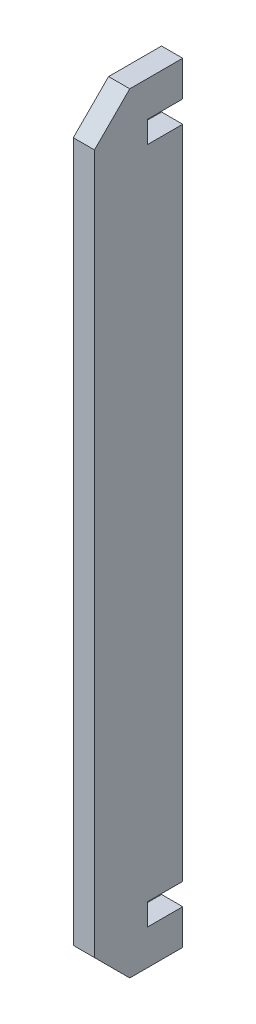
ISO-10303-21;
HEADER;
FILE_DESCRIPTION(('STEP AP214'),'2;1');
FILE_NAME('part.step','',(''),(''),'','','');
FILE_SCHEMA(('AUTOMOTIVE_DESIGN { 1 0 10303 214 1 1 1 1 }'));
ENDSEC;
DATA;
#1=APPLICATION_CONTEXT('core data for automotive mechanical design processes');
#2=APPLICATION_PROTOCOL_DEFINITION('international standard','automotive_design',2000,#1);
#3=PRODUCT_CONTEXT('',#1,'mechanical');
#4=PRODUCT('Part','Part','',(#3));
#5=PRODUCT_RELATED_PRODUCT_CATEGORY('part','',(#4));
#6=PRODUCT_DEFINITION_FORMATION('','',#4);
#7=PRODUCT_DEFINITION_CONTEXT('part definition',#1,'design');
#8=PRODUCT_DEFINITION('design','',#6,#7);
#9=PRODUCT_DEFINITION_SHAPE('','',#8);
#10=(LENGTH_UNIT() NAMED_UNIT(*) SI_UNIT(.MILLI.,.METRE.));
#11=(NAMED_UNIT(*) PLANE_ANGLE_UNIT() SI_UNIT($,.RADIAN.));
#12=(NAMED_UNIT(*) SI_UNIT($,.STERADIAN.) SOLID_ANGLE_UNIT());
#13=UNCERTAINTY_MEASURE_WITH_UNIT(LENGTH_MEASURE(1.E-05),#10,'distance_accuracy_value','');
#14=(GEOMETRIC_REPRESENTATION_CONTEXT(3) GLOBAL_UNCERTAINTY_ASSIGNED_CONTEXT((#13)) GLOBAL_UNIT_ASSIGNED_CONTEXT((#10,
#11,#12)) REPRESENTATION_CONTEXT('',''));
#15=CARTESIAN_POINT('',(0.,0.,0.));
#16=DIRECTION('',(0.,0.,1.));
#17=DIRECTION('',(1.,0.,0.));
#18=AXIS2_PLACEMENT_3D('',#15,#16,#17);
#19=CARTESIAN_POINT('',(3.,0.,0.223880597014859));
#20=DIRECTION('',(0.,0.,1.));
#21=DIRECTION('',(0.,-1.,0.));
#22=AXIS2_PLACEMENT_3D('',#19,#20,#21);
#23=PLANE('',#22);
#24=DIRECTION('',(0.,1.,0.));
#25=VECTOR('',#24,1.);
#26=CARTESIAN_POINT('',(0.,0.,0.223880597014859));
#27=LINE('',#26,#25);
#28=CARTESIAN_POINT('',(0.,-17.9216417910448,0.223880597014854));
#29=VERTEX_POINT('',#28);
#30=CARTESIAN_POINT('',(0.,74.9783582089553,0.223880597014877));
#31=VERTEX_POINT('',#30);
#32=EDGE_CURVE('E178',#29,#31,#27,.T.);
#33=ORIENTED_EDGE('',*,*,#32,.T.);
#34=DIRECTION('',(-1.,0.,0.));
#35=VECTOR('',#34,1.);
#36=CARTESIAN_POINT('',(3.,74.9783582089553,0.223880597014877));
#37=LINE('',#36,#35);
#38=CARTESIAN_POINT('',(3.,74.9783582089553,0.223880597014877));
#39=VERTEX_POINT('',#38);
#40=EDGE_CURVE('E161',#39,#31,#37,.T.);
#41=ORIENTED_EDGE('',*,*,#40,.F.);
#42=DIRECTION('',(0.,1.,0.));
#43=VECTOR('',#42,1.);
#44=CARTESIAN_POINT('',(3.,0.,0.223880597014859));
#45=LINE('',#44,#43);
#46=CARTESIAN_POINT('',(3.,-17.9216417910448,0.223880597014854));
#47=VERTEX_POINT('',#46);
#48=EDGE_CURVE('E167',#47,#39,#45,.T.);
#49=ORIENTED_EDGE('',*,*,#48,.F.);
#50=DIRECTION('',(-1.,0.,0.));
#51=VECTOR('',#50,1.);
#52=CARTESIAN_POINT('',(3.,-17.9216417910448,0.223880597014854));
#53=LINE('',#52,#51);
#54=EDGE_CURVE('E234',#47,#29,#53,.T.);
#55=ORIENTED_EDGE('',*,*,#54,.T.);
#56=EDGE_LOOP('',(#33,#41,#49,#55));
#57=FACE_BOUND('',#56,.T.);
#58=ADVANCED_FACE('F51',(#57),#23,.F.);
#59=CARTESIAN_POINT('',(3.,74.9783582089553,0.));
#60=DIRECTION('',(0.,-1.,0.));
#61=DIRECTION('',(0.,0.,-1.));
#62=AXIS2_PLACEMENT_3D('',#59,#60,#61);
#63=PLANE('',#62);
#64=DIRECTION('',(0.,0.,1.));
#65=VECTOR('',#64,1.);
#66=CARTESIAN_POINT('',(0.,74.9783582089553,0.));
#67=LINE('',#66,#65);
#68=CARTESIAN_POINT('',(0.,74.9783582089553,5.22388059701595));
#69=VERTEX_POINT('',#68);
#70=EDGE_CURVE('E261',#31,#69,#67,.T.);
#71=ORIENTED_EDGE('',*,*,#70,.T.);
#72=DIRECTION('',(-1.,0.,0.));
#73=VECTOR('',#72,1.);
#74=CARTESIAN_POINT('',(3.,74.9783582089553,5.22388059701595));
#75=LINE('',#74,#73);
#76=CARTESIAN_POINT('',(3.,74.9783582089553,5.22388059701595));
#77=VERTEX_POINT('',#76);
#78=EDGE_CURVE('E164',#77,#69,#75,.T.);
#79=ORIENTED_EDGE('',*,*,#78,.F.);
#80=DIRECTION('',(0.,0.,1.));
#81=VECTOR('',#80,1.);
#82=CARTESIAN_POINT('',(3.,74.9783582089553,0.));
#83=LINE('',#82,#81);
#84=EDGE_CURVE('E157',#39,#77,#83,.T.);
#85=ORIENTED_EDGE('',*,*,#84,.F.);
#86=ORIENTED_EDGE('',*,*,#40,.T.);
#87=EDGE_LOOP('',(#71,#79,#85,#86));
#88=FACE_BOUND('',#87,.T.);
#89=ADVANCED_FACE('F159',(#88),#63,.F.);
#90=CARTESIAN_POINT('',(3.,-1.16928881385061E-13,5.22388059701532));
#91=DIRECTION('',(0.,0.,1.));
#92=DIRECTION('',(0.,-1.,0.));
#93=AXIS2_PLACEMENT_3D('',#90,#91,#92);
#94=PLANE('',#93);
#95=DIRECTION('',(0.,1.,0.));
#96=VECTOR('',#95,1.);
#97=CARTESIAN_POINT('',(0.,-1.16928881385061E-13,5.22388059701532));
#98=LINE('',#97,#96);
#99=CARTESIAN_POINT('',(0.,78.0783582089553,5.2238805970149));
#100=VERTEX_POINT('',#99);
#101=EDGE_CURVE('E259',#69,#100,#98,.T.);
#102=ORIENTED_EDGE('',*,*,#101,.T.);
#103=DIRECTION('',(-1.,0.,0.));
#104=VECTOR('',#103,1.);
#105=CARTESIAN_POINT('',(3.,78.0783582089553,5.2238805970149));
#106=LINE('',#105,#104);
#107=CARTESIAN_POINT('',(3.,78.0783582089553,5.2238805970149));
#108=VERTEX_POINT('',#107);
#109=EDGE_CURVE('E183',#108,#100,#106,.T.);
#110=ORIENTED_EDGE('',*,*,#109,.F.);
#111=DIRECTION('',(0.,1.,0.));
#112=VECTOR('',#111,1.);
#113=CARTESIAN_POINT('',(3.,-1.16928881385061E-13,5.22388059701532));
#114=LINE('',#113,#112);
#115=EDGE_CURVE('E166',#77,#108,#114,.T.);
#116=ORIENTED_EDGE('',*,*,#115,.F.);
#117=ORIENTED_EDGE('',*,*,#78,.T.);
#118=EDGE_LOOP('',(#102,#110,#116,#117));
#119=FACE_BOUND('',#118,.T.);
#120=ADVANCED_FACE('F260',(#119),#94,.F.);
#121=CARTESIAN_POINT('',(3.,78.0783582089553,0.));
#122=DIRECTION('',(0.,-1.,0.));
#123=DIRECTION('',(0.,0.,-1.));
#124=AXIS2_PLACEMENT_3D('',#121,#122,#123);
#125=PLANE('',#124);
#126=DIRECTION('',(0.,0.,1.));
#127=VECTOR('',#126,1.);
#128=CARTESIAN_POINT('',(0.,78.0783582089553,0.));
#129=LINE('',#128,#127);
#130=CARTESIAN_POINT('',(0.,78.0783582089553,0.223880597014877));
#131=VERTEX_POINT('',#130);
#132=EDGE_CURVE('E222',#131,#100,#129,.T.);
#133=ORIENTED_EDGE('',*,*,#132,.F.);
#134=DIRECTION('',(-1.,0.,0.));
#135=VECTOR('',#134,1.);
#136=CARTESIAN_POINT('',(3.,78.0783582089553,0.223880597014877));
#137=LINE('',#136,#135);
#138=CARTESIAN_POINT('',(3.,78.0783582089553,0.223880597014877));
#139=VERTEX_POINT('',#138);
#140=EDGE_CURVE('E247',#139,#131,#137,.T.);
#141=ORIENTED_EDGE('',*,*,#140,.F.);
#142=DIRECTION('',(0.,0.,1.));
#143=VECTOR('',#142,1.);
#144=CARTESIAN_POINT('',(3.,78.0783582089553,0.));
#145=LINE('',#144,#143);
#146=EDGE_CURVE('E256',#139,#108,#145,.T.);
#147=ORIENTED_EDGE('',*,*,#146,.T.);
#148=ORIENTED_EDGE('',*,*,#109,.T.);
#149=EDGE_LOOP('',(#133,#141,#147,#148));
#150=FACE_BOUND('',#149,.T.);
#151=ADVANCED_FACE('F253',(#150),#125,.T.);
#152=CARTESIAN_POINT('',(3.,0.,0.223880597014859));
#153=DIRECTION('',(0.,0.,1.));
#154=DIRECTION('',(0.,-1.,0.));
#155=AXIS2_PLACEMENT_3D('',#152,#153,#154);
#156=PLANE('',#155);
#157=DIRECTION('',(0.,1.,0.));
#158=VECTOR('',#157,1.);
#159=CARTESIAN_POINT('',(0.,0.,0.223880597014859));
#160=LINE('',#159,#158);
#161=CARTESIAN_POINT('',(0.,83.0783582089552,0.223880597014879));
#162=VERTEX_POINT('',#161);
#163=EDGE_CURVE('E218',#131,#162,#160,.T.);
#164=ORIENTED_EDGE('',*,*,#163,.T.);
#165=DIRECTION('',(-1.,0.,0.));
#166=VECTOR('',#165,1.);
#167=CARTESIAN_POINT('',(3.,83.0783582089552,0.223880597014879));
#168=LINE('',#167,#166);
#169=CARTESIAN_POINT('',(3.,83.0783582089552,0.223880597014879));
#170=VERTEX_POINT('',#169);
#171=EDGE_CURVE('E217',#170,#162,#168,.T.);
#172=ORIENTED_EDGE('',*,*,#171,.F.);
#173=DIRECTION('',(0.,1.,0.));
#174=VECTOR('',#173,1.);
#175=CARTESIAN_POINT('',(3.,0.,0.223880597014859));
#176=LINE('',#175,#174);
#177=EDGE_CURVE('E273',#139,#170,#176,.T.);
#178=ORIENTED_EDGE('',*,*,#177,.F.);
#179=ORIENTED_EDGE('',*,*,#140,.T.);
#180=EDGE_LOOP('',(#164,#172,#178,#179));
#181=FACE_BOUND('',#180,.T.);
#182=ADVANCED_FACE('F321',(#181),#156,.F.);
#183=CARTESIAN_POINT('',(3.,83.0783582089552,0.));
#184=DIRECTION('',(0.,-1.,0.));
#185=DIRECTION('',(0.,0.,-1.));
#186=AXIS2_PLACEMENT_3D('',#183,#184,#185);
#187=PLANE('',#186);
#188=DIRECTION('',(0.,0.,1.));
#189=VECTOR('',#188,1.);
#190=CARTESIAN_POINT('',(0.,83.0783582089552,0.));
#191=LINE('',#190,#189);
#192=CARTESIAN_POINT('',(0.,83.0783582089552,7.72388059701492));
#193=VERTEX_POINT('',#192);
#194=EDGE_CURVE('E212',#162,#193,#191,.T.);
#195=ORIENTED_EDGE('',*,*,#194,.T.);
#196=DIRECTION('',(1.,0.,0.));
#197=VECTOR('',#196,1.);
#198=CARTESIAN_POINT('',(3.,83.0783582089552,7.72388059701492));
#199=LINE('',#198,#197);
#200=CARTESIAN_POINT('',(3.,83.0783582089552,7.72388059701492));
#201=VERTEX_POINT('',#200);
#202=EDGE_CURVE('E75',#193,#201,#199,.T.);
#203=ORIENTED_EDGE('',*,*,#202,.T.);
#204=DIRECTION('',(0.,0.,1.));
#205=VECTOR('',#204,1.);
#206=CARTESIAN_POINT('',(3.,83.0783582089552,0.));
#207=LINE('',#206,#205);
#208=EDGE_CURVE('E197',#170,#201,#207,.T.);
#209=ORIENTED_EDGE('',*,*,#208,.F.);
#210=ORIENTED_EDGE('',*,*,#171,.T.);
#211=EDGE_LOOP('',(#195,#203,#209,#210));
#212=FACE_BOUND('',#211,.T.);
#213=ADVANCED_FACE('F215',(#212),#187,.F.);
#214=CARTESIAN_POINT('',(3.,0.,12.7238805970149));
#215=DIRECTION('',(0.,0.,1.));
#216=DIRECTION('',(0.,-1.,0.));
#217=AXIS2_PLACEMENT_3D('',#214,#215,#216);
#218=PLANE('',#217);
#219=DIRECTION('',(0.,1.,0.));
#220=VECTOR('',#219,1.);
#221=CARTESIAN_POINT('',(3.,0.,12.7238805970149));
#222=LINE('',#221,#220);
#223=CARTESIAN_POINT('',(3.,-21.0216417910448,12.7238805970149));
#224=VERTEX_POINT('',#223);
#225=CARTESIAN_POINT('',(3.,78.0783582089552,12.7238805970149));
#226=VERTEX_POINT('',#225);
#227=EDGE_CURVE('E196',#224,#226,#222,.T.);
#228=ORIENTED_EDGE('',*,*,#227,.T.);
#229=DIRECTION('',(-1.,0.,0.));
#230=VECTOR('',#229,1.);
#231=CARTESIAN_POINT('',(0.,78.0783582089552,12.7238805970149));
#232=LINE('',#231,#230);
#233=CARTESIAN_POINT('',(0.,78.0783582089552,12.7238805970149));
#234=VERTEX_POINT('',#233);
#235=EDGE_CURVE('E181',#226,#234,#232,.T.);
#236=ORIENTED_EDGE('',*,*,#235,.T.);
#237=DIRECTION('',(0.,1.,0.));
#238=VECTOR('',#237,1.);
#239=CARTESIAN_POINT('',(0.,0.,12.7238805970149));
#240=LINE('',#239,#238);
#241=CARTESIAN_POINT('',(0.,-21.0216417910448,12.7238805970149));
#242=VERTEX_POINT('',#241);
#243=EDGE_CURVE('E213',#242,#234,#240,.T.);
#244=ORIENTED_EDGE('',*,*,#243,.F.);
#245=DIRECTION('',(1.,0.,0.));
#246=VECTOR('',#245,1.);
#247=CARTESIAN_POINT('',(3.,-21.0216417910448,12.7238805970149));
#248=LINE('',#247,#246);
#249=EDGE_CURVE('E179',#242,#224,#248,.T.);
#250=ORIENTED_EDGE('',*,*,#249,.T.);
#251=EDGE_LOOP('',(#228,#236,#244,#250));
#252=FACE_BOUND('',#251,.T.);
#253=ADVANCED_FACE('F201',(#252),#218,.T.);
#254=CARTESIAN_POINT('',(3.,-26.0216417910448,0.));
#255=DIRECTION('',(0.,-1.,0.));
#256=DIRECTION('',(0.,0.,-1.));
#257=AXIS2_PLACEMENT_3D('',#254,#255,#256);
#258=PLANE('',#257);
#259=DIRECTION('',(0.,0.,1.));
#260=VECTOR('',#259,1.);
#261=CARTESIAN_POINT('',(3.,-26.0216417910448,0.));
#262=LINE('',#261,#260);
#263=CARTESIAN_POINT('',(3.,-26.0216417910448,0.223880597014853));
#264=VERTEX_POINT('',#263);
#265=CARTESIAN_POINT('',(3.,-26.0216417910448,7.72388059701493));
#266=VERTEX_POINT('',#265);
#267=EDGE_CURVE('E205',#264,#266,#262,.T.);
#268=ORIENTED_EDGE('',*,*,#267,.T.);
#269=DIRECTION('',(-1.,0.,0.));
#270=VECTOR('',#269,1.);
#271=CARTESIAN_POINT('',(3.,-26.0216417910448,7.72388059701493));
#272=LINE('',#271,#270);
#273=CARTESIAN_POINT('',(0.,-26.0216417910448,7.72388059701493));
#274=VERTEX_POINT('',#273);
#275=EDGE_CURVE('E11',#266,#274,#272,.T.);
#276=ORIENTED_EDGE('',*,*,#275,.T.);
#277=DIRECTION('',(0.,0.,1.));
#278=VECTOR('',#277,1.);
#279=CARTESIAN_POINT('',(0.,-26.0216417910448,0.));
#280=LINE('',#279,#278);
#281=CARTESIAN_POINT('',(0.,-26.0216417910448,0.223880597014853));
#282=VERTEX_POINT('',#281);
#283=EDGE_CURVE('E220',#282,#274,#280,.T.);
#284=ORIENTED_EDGE('',*,*,#283,.F.);
#285=DIRECTION('',(-1.,0.,0.));
#286=VECTOR('',#285,1.);
#287=CARTESIAN_POINT('',(3.,-26.0216417910448,0.223880597014853));
#288=LINE('',#287,#286);
#289=EDGE_CURVE('E244',#264,#282,#288,.T.);
#290=ORIENTED_EDGE('',*,*,#289,.F.);
#291=EDGE_LOOP('',(#268,#276,#284,#290));
#292=FACE_BOUND('',#291,.T.);
#293=ADVANCED_FACE('F297',(#292),#258,.T.);
#294=CARTESIAN_POINT('',(0.,-21.0216417910448,0.223880597014854));
#295=VERTEX_POINT('',#294);
#296=EDGE_CURVE('E224',#282,#295,#160,.T.);
#297=ORIENTED_EDGE('',*,*,#296,.T.);
#298=DIRECTION('',(-1.,0.,0.));
#299=VECTOR('',#298,1.);
#300=CARTESIAN_POINT('',(3.,-21.0216417910448,0.223880597014854));
#301=LINE('',#300,#299);
#302=CARTESIAN_POINT('',(3.,-21.0216417910448,0.223880597014854));
#303=VERTEX_POINT('',#302);
#304=EDGE_CURVE('E241',#303,#295,#301,.T.);
#305=ORIENTED_EDGE('',*,*,#304,.F.);
#306=EDGE_CURVE('E270',#264,#303,#176,.T.);
#307=ORIENTED_EDGE('',*,*,#306,.F.);
#308=ORIENTED_EDGE('',*,*,#289,.T.);
#309=EDGE_LOOP('',(#297,#305,#307,#308));
#310=FACE_BOUND('',#309,.T.);
#311=ADVANCED_FACE('F295',(#310),#156,.F.);
#312=CARTESIAN_POINT('',(3.,-21.0216417910448,0.));
#313=DIRECTION('',(0.,-1.,0.));
#314=DIRECTION('',(0.,0.,-1.));
#315=AXIS2_PLACEMENT_3D('',#312,#313,#314);
#316=PLANE('',#315);
#317=DIRECTION('',(0.,0.,1.));
#318=VECTOR('',#317,1.);
#319=CARTESIAN_POINT('',(0.,-21.0216417910448,0.));
#320=LINE('',#319,#318);
#321=CARTESIAN_POINT('',(0.,-21.0216417910448,5.22388059701485));
#322=VERTEX_POINT('',#321);
#323=EDGE_CURVE('E229',#295,#322,#320,.T.);
#324=ORIENTED_EDGE('',*,*,#323,.T.);
#325=DIRECTION('',(-1.,0.,0.));
#326=VECTOR('',#325,1.);
#327=CARTESIAN_POINT('',(3.,-21.0216417910448,5.22388059701485));
#328=LINE('',#327,#326);
#329=CARTESIAN_POINT('',(3.,-21.0216417910448,5.22388059701485));
#330=VERTEX_POINT('',#329);
#331=EDGE_CURVE('E238',#330,#322,#328,.T.);
#332=ORIENTED_EDGE('',*,*,#331,.F.);
#333=DIRECTION('',(0.,0.,1.));
#334=VECTOR('',#333,1.);
#335=CARTESIAN_POINT('',(3.,-21.0216417910448,0.));
#336=LINE('',#335,#334);
#337=EDGE_CURVE('E268',#303,#330,#336,.T.);
#338=ORIENTED_EDGE('',*,*,#337,.F.);
#339=ORIENTED_EDGE('',*,*,#304,.T.);
#340=EDGE_LOOP('',(#324,#332,#338,#339));
#341=FACE_BOUND('',#340,.T.);
#342=ADVANCED_FACE('F291',(#341),#316,.F.);
#343=CARTESIAN_POINT('',(0.,-17.9216417910448,5.22388059701492));
#344=VERTEX_POINT('',#343);
#345=EDGE_CURVE('E231',#322,#344,#98,.T.);
#346=ORIENTED_EDGE('',*,*,#345,.T.);
#347=DIRECTION('',(-1.,0.,0.));
#348=VECTOR('',#347,1.);
#349=CARTESIAN_POINT('',(3.,-17.9216417910448,5.22388059701492));
#350=LINE('',#349,#348);
#351=CARTESIAN_POINT('',(3.,-17.9216417910448,5.22388059701492));
#352=VERTEX_POINT('',#351);
#353=EDGE_CURVE('E236',#352,#344,#350,.T.);
#354=ORIENTED_EDGE('',*,*,#353,.F.);
#355=EDGE_CURVE('E267',#330,#352,#114,.T.);
#356=ORIENTED_EDGE('',*,*,#355,.F.);
#357=ORIENTED_EDGE('',*,*,#331,.T.);
#358=EDGE_LOOP('',(#346,#354,#356,#357));
#359=FACE_BOUND('',#358,.T.);
#360=ADVANCED_FACE('F282',(#359),#94,.F.);
#361=CARTESIAN_POINT('',(3.,-17.9216417910448,0.));
#362=DIRECTION('',(0.,-1.,0.));
#363=DIRECTION('',(0.,0.,-1.));
#364=AXIS2_PLACEMENT_3D('',#361,#362,#363);
#365=PLANE('',#364);
#366=DIRECTION('',(0.,0.,1.));
#367=VECTOR('',#366,1.);
#368=CARTESIAN_POINT('',(0.,-17.9216417910448,0.));
#369=LINE('',#368,#367);
#370=EDGE_CURVE('E175',#29,#344,#369,.T.);
#371=ORIENTED_EDGE('',*,*,#370,.F.);
#372=ORIENTED_EDGE('',*,*,#54,.F.);
#373=DIRECTION('',(0.,0.,1.));
#374=VECTOR('',#373,1.);
#375=CARTESIAN_POINT('',(3.,-17.9216417910448,0.));
#376=LINE('',#375,#374);
#377=EDGE_CURVE('E173',#47,#352,#376,.T.);
#378=ORIENTED_EDGE('',*,*,#377,.T.);
#379=ORIENTED_EDGE('',*,*,#353,.T.);
#380=EDGE_LOOP('',(#371,#372,#378,#379));
#381=FACE_BOUND('',#380,.T.);
#382=ADVANCED_FACE('F286',(#381),#365,.T.);
#383=CARTESIAN_POINT('',(3.,0.,0.));
#384=DIRECTION('',(1.,0.,0.));
#385=DIRECTION('',(0.,0.,-1.));
#386=AXIS2_PLACEMENT_3D('',#383,#384,#385);
#387=PLANE('',#386);
#388=ORIENTED_EDGE('',*,*,#208,.T.);
#389=DIRECTION('',(0.,-0.707106781186546,0.707106781186549));
#390=VECTOR('',#389,1.);
#391=CARTESIAN_POINT('',(3.,45.4011194029852,45.4011194029851));
#392=LINE('',#391,#390);
#393=EDGE_CURVE('E60',#201,#226,#392,.T.);
#394=ORIENTED_EDGE('',*,*,#393,.T.);
#395=ORIENTED_EDGE('',*,*,#227,.F.);
#396=DIRECTION('',(0.,0.707106781186549,0.707106781186547));
#397=VECTOR('',#396,1.);
#398=CARTESIAN_POINT('',(3.,-16.8727611940298,16.8727611940299));
#399=LINE('',#398,#397);
#400=EDGE_CURVE('E67',#224,#266,#399,.F.);
#401=ORIENTED_EDGE('',*,*,#400,.T.);
#402=ORIENTED_EDGE('',*,*,#267,.F.);
#403=ORIENTED_EDGE('',*,*,#306,.T.);
#404=ORIENTED_EDGE('',*,*,#337,.T.);
#405=ORIENTED_EDGE('',*,*,#355,.T.);
#406=ORIENTED_EDGE('',*,*,#377,.F.);
#407=ORIENTED_EDGE('',*,*,#48,.T.);
#408=ORIENTED_EDGE('',*,*,#84,.T.);
#409=ORIENTED_EDGE('',*,*,#115,.T.);
#410=ORIENTED_EDGE('',*,*,#146,.F.);
#411=ORIENTED_EDGE('',*,*,#177,.T.);
#412=EDGE_LOOP('',(#388,#394,#395,#401,#402,#403,#404,#405,#406,#407,#408,#409,#410,#411));
#413=FACE_BOUND('',#412,.T.);
#414=ADVANCED_FACE('F171',(#413),#387,.T.);
#415=CARTESIAN_POINT('',(0.,0.,0.));
#416=DIRECTION('',(1.,0.,0.));
#417=DIRECTION('',(0.,0.,-1.));
#418=AXIS2_PLACEMENT_3D('',#415,#416,#417);
#419=PLANE('',#418);
#420=ORIENTED_EDGE('',*,*,#243,.T.);
#421=DIRECTION('',(0.,0.707106781186546,-0.707106781186549));
#422=VECTOR('',#421,1.);
#423=CARTESIAN_POINT('',(0.,78.0783582089552,12.7238805970149));
#424=LINE('',#423,#422);
#425=EDGE_CURVE('E191',#234,#193,#424,.T.);
#426=ORIENTED_EDGE('',*,*,#425,.T.);
#427=ORIENTED_EDGE('',*,*,#194,.F.);
#428=ORIENTED_EDGE('',*,*,#163,.F.);
#429=ORIENTED_EDGE('',*,*,#132,.T.);
#430=ORIENTED_EDGE('',*,*,#101,.F.);
#431=ORIENTED_EDGE('',*,*,#70,.F.);
#432=ORIENTED_EDGE('',*,*,#32,.F.);
#433=ORIENTED_EDGE('',*,*,#370,.T.);
#434=ORIENTED_EDGE('',*,*,#345,.F.);
#435=ORIENTED_EDGE('',*,*,#323,.F.);
#436=ORIENTED_EDGE('',*,*,#296,.F.);
#437=ORIENTED_EDGE('',*,*,#283,.T.);
#438=DIRECTION('',(0.,-0.707106781186549,-0.707106781186547));
#439=VECTOR('',#438,1.);
#440=CARTESIAN_POINT('',(0.,-26.0216417910448,7.72388059701493));
#441=LINE('',#440,#439);
#442=EDGE_CURVE('E189',#274,#242,#441,.F.);
#443=ORIENTED_EDGE('',*,*,#442,.T.);
#444=EDGE_LOOP('',(#420,#426,#427,#428,#429,#430,#431,#432,#433,#434,#435,#436,#437,#443));
#445=FACE_BOUND('',#444,.T.);
#446=ADVANCED_FACE('F210',(#445),#419,.F.);
#447=CARTESIAN_POINT('',(3.,78.0783582089552,12.7238805970149));
#448=DIRECTION('',(0.,0.707106781186549,0.707106781186546));
#449=DIRECTION('',(1.,0.,0.));
#450=AXIS2_PLACEMENT_3D('',#447,#448,#449);
#451=PLANE('',#450);
#452=ORIENTED_EDGE('',*,*,#393,.F.);
#453=ORIENTED_EDGE('',*,*,#202,.F.);
#454=ORIENTED_EDGE('',*,*,#425,.F.);
#455=ORIENTED_EDGE('',*,*,#235,.F.);
#456=EDGE_LOOP('',(#452,#453,#454,#455));
#457=FACE_BOUND('',#456,.T.);
#458=ADVANCED_FACE('F207',(#457),#451,.T.);
#459=CARTESIAN_POINT('',(3.,-26.0216417910448,7.72388059701493));
#460=DIRECTION('',(0.,0.707106781186546,-0.707106781186548));
#461=DIRECTION('',(-1.,0.,0.));
#462=AXIS2_PLACEMENT_3D('',#459,#460,#461);
#463=PLANE('',#462);
#464=ORIENTED_EDGE('',*,*,#400,.F.);
#465=ORIENTED_EDGE('',*,*,#249,.F.);
#466=ORIENTED_EDGE('',*,*,#442,.F.);
#467=ORIENTED_EDGE('',*,*,#275,.F.);
#468=EDGE_LOOP('',(#464,#465,#466,#467));
#469=FACE_BOUND('',#468,.T.);
#470=ADVANCED_FACE('F54',(#469),#463,.F.);
#471=CLOSED_SHELL('',(#58,#89,#120,#151,#182,#213,#253,#293,#311,#342,#360,#382,#414,#446,#458,#470));
#472=MANIFOLD_SOLID_BREP('B2',#471);
#473=ADVANCED_BREP_SHAPE_REPRESENTATION('',(#18,#472),#14);
#474=SHAPE_DEFINITION_REPRESENTATION(#9,#473);
ENDSEC;
END-ISO-10303-21;
